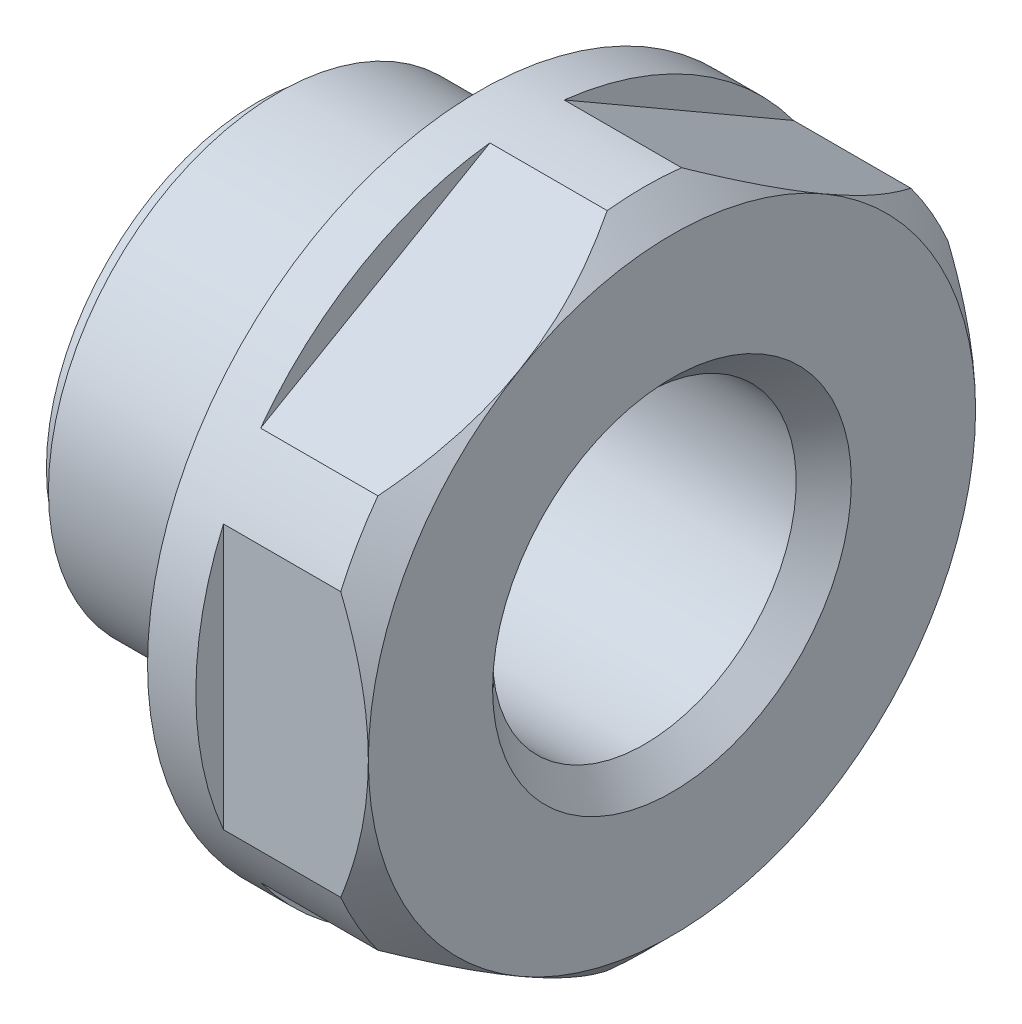
ISO-10303-21;
HEADER;
FILE_DESCRIPTION(('STEP AP214'),'2;1');
FILE_NAME('part.step','',(''),(''),'','','');
FILE_SCHEMA(('AUTOMOTIVE_DESIGN { 1 0 10303 214 1 1 1 1 }'));
ENDSEC;
DATA;
#1=APPLICATION_CONTEXT('core data for automotive mechanical design processes');
#2=APPLICATION_PROTOCOL_DEFINITION('international standard','automotive_design',2000,#1);
#3=PRODUCT_CONTEXT('',#1,'mechanical');
#4=PRODUCT('Part','Part','',(#3));
#5=PRODUCT_RELATED_PRODUCT_CATEGORY('part','',(#4));
#6=PRODUCT_DEFINITION_FORMATION('','',#4);
#7=PRODUCT_DEFINITION_CONTEXT('part definition',#1,'design');
#8=PRODUCT_DEFINITION('design','',#6,#7);
#9=PRODUCT_DEFINITION_SHAPE('','',#8);
#10=(LENGTH_UNIT() NAMED_UNIT(*) SI_UNIT(.MILLI.,.METRE.));
#11=(NAMED_UNIT(*) PLANE_ANGLE_UNIT() SI_UNIT($,.RADIAN.));
#12=(NAMED_UNIT(*) SI_UNIT($,.STERADIAN.) SOLID_ANGLE_UNIT());
#13=UNCERTAINTY_MEASURE_WITH_UNIT(LENGTH_MEASURE(1.E-05),#10,'distance_accuracy_value','');
#14=(GEOMETRIC_REPRESENTATION_CONTEXT(3) GLOBAL_UNCERTAINTY_ASSIGNED_CONTEXT((#13)) GLOBAL_UNIT_ASSIGNED_CONTEXT((#10,
#11,#12)) REPRESENTATION_CONTEXT('',''));
#15=CARTESIAN_POINT('',(0.,0.,0.));
#16=DIRECTION('',(0.,0.,1.));
#17=DIRECTION('',(1.,0.,0.));
#18=AXIS2_PLACEMENT_3D('',#15,#16,#17);
#19=CARTESIAN_POINT('',(15.,0.,0.));
#20=DIRECTION('',(-1.,0.,0.));
#21=DIRECTION('',(0.,0.,1.));
#22=AXIS2_PLACEMENT_3D('',#19,#20,#21);
#23=CONICAL_SURFACE('',#22,11.,0.785398163397449);
#24=CARTESIAN_POINT('',(13.9998,11.9244454096136,-1.34625469846722));
#25=CARTESIAN_POINT('',(14.1445628224522,11.7433959712892,-1.65984152432685));
#26=CARTESIAN_POINT('',(14.277541111226,11.5597804150405,-1.97787299680962));
#27=CARTESIAN_POINT('',(14.5146606594606,11.1874333370648,-2.62279705391353));
#28=CARTESIAN_POINT('',(14.6187222079065,10.9986892179367,-2.94971145787311));
#29=CARTESIAN_POINT('',(14.7911203117433,10.6187883903896,-3.60771899302234));
#30=CARTESIAN_POINT('',(14.8597656624482,10.4276679487631,-3.93874930828441));
#31=CARTESIAN_POINT('',(14.9335387949349,10.1392745048446,-4.43826140572109));
#32=CARTESIAN_POINT('',(14.9532620837518,10.0428945325663,-4.60519641453914));
#33=CARTESIAN_POINT('',(14.9826716146614,9.84975687211723,-4.93972065529193));
#34=CARTESIAN_POINT('',(14.9923593772953,9.75299924339799,-5.10730978425354));
#35=CARTESIAN_POINT('',(15.0013107847755,9.56348157904689,-5.43556400784146));
#36=CARTESIAN_POINT('',(15.0010000283072,9.47072644596864,-5.59622061099581));
#37=CARTESIAN_POINT('',(14.9910102119169,9.28534750229271,-5.91730636009597));
#38=CARTESIAN_POINT('',(14.981331655875,9.19272368490012,-6.07773551781094));
#39=CARTESIAN_POINT('',(14.9527693103516,9.00779350728968,-6.39804398128498));
#40=CARTESIAN_POINT('',(14.9338816980687,8.91548729495293,-6.55792303090647));
#41=CARTESIAN_POINT('',(14.8872257434231,8.73143337639274,-6.87671376918489));
#42=CARTESIAN_POINT('',(14.8594562488222,8.63968574420791,-7.03562532960317));
#43=CARTESIAN_POINT('',(14.763539044129,8.36578077209581,-7.51004265774708));
#44=CARTESIAN_POINT('',(14.6827411679731,8.18470629309542,-7.82367285532985));
#45=CARTESIAN_POINT('',(14.4918531093591,7.82650640430548,-8.44409326197959));
#46=CARTESIAN_POINT('',(14.3817585477406,7.64938158919044,-8.75088244104009));
#47=CARTESIAN_POINT('',(14.2187469556671,7.4161941000492,-9.15477501992216));
#48=CARTESIAN_POINT('',(14.1766721186819,7.35818353518767,-9.2552522656381));
#49=CARTESIAN_POINT('',(14.0900573229802,7.24274274158698,-9.45520158542059));
#50=CARTESIAN_POINT('',(14.0455219230475,7.18531165829434,-9.55467513961716));
#51=CARTESIAN_POINT('',(13.9998,7.12811347364407,-9.65374530153214));
#52=B_SPLINE_CURVE_WITH_KNOTS('',3,(#24,#25,#26,#27,#28,#29,#30,#31,#32,#33,#34,#35,#36,#37,#38,
#39,#40,#41,#42,#43,#44,#45,#46,#47,#48,#49,#50,#51),.UNSPECIFIED.,.F.,.F.,(4,2,2,2,2,2,2,2,2,2,
2,2,2,4),(0.,1.1702566741639,2.34370794522264,3.50674717519695,4.08782903846716,
4.66882284573654,5.22512004686029,5.78138732724696,6.33788571841848,6.89445633290154,
8.00606836288785,9.117846645962,9.48807194630575,9.85763292940879),.UNSPECIFIED.);
#53=CARTESIAN_POINT('',(14.,11.9241952032853,-1.34668806854028));
#54=VERTEX_POINT('',#53);
#55=CARTESIAN_POINT('',(15.,9.52627944162884,-5.49999999999968));
#56=VERTEX_POINT('',#55);
#57=EDGE_CURVE('E203',#54,#56,#52,.T.);
#58=ORIENTED_EDGE('',*,*,#57,.F.);
#59=CARTESIAN_POINT('',(14.,0.,0.));
#60=DIRECTION('',(-1.,0.,0.));
#61=DIRECTION('',(0.,0.,1.));
#62=AXIS2_PLACEMENT_3D('',#59,#60,#61);
#63=CIRCLE('',#62,12.);
#64=CARTESIAN_POINT('',(14.,11.9241952032853,1.34668806854029));
#65=VERTEX_POINT('',#64);
#66=EDGE_CURVE('E281',#65,#54,#63,.T.);
#67=ORIENTED_EDGE('',*,*,#66,.F.);
#68=CARTESIAN_POINT('',(13.9998,7.12811347364407,9.65374530153214));
#69=CARTESIAN_POINT('',(14.1445628224522,7.30916291196844,9.34015847567251));
#70=CARTESIAN_POINT('',(14.277541111226,7.49277846821713,9.02212700318974));
#71=CARTESIAN_POINT('',(14.5146606594606,7.86512554619291,8.37720294608584));
#72=CARTESIAN_POINT('',(14.6187222079065,8.05386966532093,8.05028854212626));
#73=CARTESIAN_POINT('',(14.7911203117433,8.43377049286812,7.39228100697703));
#74=CARTESIAN_POINT('',(14.8597656624482,8.62489093449459,7.06125069171495));
#75=CARTESIAN_POINT('',(14.9335387949349,8.91328437841312,6.56173859427827));
#76=CARTESIAN_POINT('',(14.9532620837518,9.00966435069138,6.39480358546023));
#77=CARTESIAN_POINT('',(14.9826716146614,9.20280201114045,6.06027934470743));
#78=CARTESIAN_POINT('',(14.9923593772953,9.29955963985969,5.89269021574582));
#79=CARTESIAN_POINT('',(15.0013107847755,9.48907730421079,5.5644359921579));
#80=CARTESIAN_POINT('',(15.0010000283072,9.58183243728904,5.40377938900356));
#81=CARTESIAN_POINT('',(14.9910102119169,9.76721138096496,5.08269363990339));
#82=CARTESIAN_POINT('',(14.981331655875,9.85983519835756,4.92226448218842));
#83=CARTESIAN_POINT('',(14.9527693103516,10.044765375968,4.60195601871438));
#84=CARTESIAN_POINT('',(14.9338816980687,10.1370715883047,4.44207696909289));
#85=CARTESIAN_POINT('',(14.8872257434231,10.3211255068649,4.12328623081447));
#86=CARTESIAN_POINT('',(14.8594562488222,10.4128731390498,3.96437467039619));
#87=CARTESIAN_POINT('',(14.763539044129,10.6867781111619,3.48995734225228));
#88=CARTESIAN_POINT('',(14.6827411679731,10.8678525901623,3.17632714466952));
#89=CARTESIAN_POINT('',(14.4918531093591,11.2260524789522,2.55590673801978));
#90=CARTESIAN_POINT('',(14.3817585477406,11.4031772940672,2.24911755895927));
#91=CARTESIAN_POINT('',(14.2187469556671,11.6363647832085,1.8452249800772));
#92=CARTESIAN_POINT('',(14.1766721186819,11.69437534807,1.74474773436126));
#93=CARTESIAN_POINT('',(14.0900573229802,11.8098161416707,1.54479841457878));
#94=CARTESIAN_POINT('',(14.0455219230475,11.8672472249633,1.44532486038221));
#95=CARTESIAN_POINT('',(13.9998,11.9244454096136,1.34625469846723));
#96=B_SPLINE_CURVE_WITH_KNOTS('',3,(#68,#69,#70,#71,#72,#73,#74,#75,#76,#77,#78,#79,#80,#81,#82,
#83,#84,#85,#86,#87,#88,#89,#90,#91,#92,#93,#94,#95),.UNSPECIFIED.,.F.,.F.,(4,2,2,2,2,2,2,2,2,2,
2,2,2,4),(0.,1.1702566741639,2.34370794522264,3.50674717519695,4.08782903846716,
4.66882284573654,5.22512004686029,5.78138732724696,6.33788571841848,6.89445633290154,
8.00606836288784,9.11784664596199,9.48807194630574,9.85763292940878),.UNSPECIFIED.);
#97=CARTESIAN_POINT('',(15.0000000000001,9.52627944162884,5.49999999999968));
#98=VERTEX_POINT('',#97);
#99=EDGE_CURVE('E225',#98,#65,#96,.T.);
#100=ORIENTED_EDGE('',*,*,#99,.F.);
#101=CARTESIAN_POINT('',(15.,0.,0.));
#102=DIRECTION('',(-1.,0.,0.));
#103=DIRECTION('',(0.,0.,1.));
#104=AXIS2_PLACEMENT_3D('',#101,#102,#103);
#105=CIRCLE('',#104,11.);
#106=EDGE_CURVE('E287',#98,#56,#105,.T.);
#107=ORIENTED_EDGE('',*,*,#106,.T.);
#108=EDGE_LOOP('',(#58,#67,#100,#107));
#109=FACE_BOUND('',#108,.T.);
#110=ADVANCED_FACE('F37',(#109),#23,.T.);
#111=CARTESIAN_POINT('',(14.,7.12836367997241,-9.65331193145908));
#112=VERTEX_POINT('',#111);
#113=EDGE_CURVE('E209',#56,#112,#52,.T.);
#114=ORIENTED_EDGE('',*,*,#113,.F.);
#115=CARTESIAN_POINT('',(15.,0.,-11.));
#116=VERTEX_POINT('',#115);
#117=EDGE_CURVE('E358',#56,#116,#105,.T.);
#118=ORIENTED_EDGE('',*,*,#117,.T.);
#119=CARTESIAN_POINT('',(3.96577969648767,19.0920628634969,-11.));
#120=CARTESIAN_POINT('',(4.21060873917786,18.8094938325582,-11.));
#121=CARTESIAN_POINT('',(4.45467558770401,18.5262624855258,-11.));
#122=CARTESIAN_POINT('',(4.94106332883009,17.9582967481221,-11.));
#123=CARTESIAN_POINT('',(5.18338419211057,17.6735623326491,-11.));
#124=CARTESIAN_POINT('',(5.66616492312053,17.102285723469,-11.));
#125=CARTESIAN_POINT('',(5.90662385122051,16.815742734588,-11.));
#126=CARTESIAN_POINT('',(6.3852747493329,16.2407742741586,-11.));
#127=CARTESIAN_POINT('',(6.62346672738961,15.9523488092963,-11.));
#128=CARTESIAN_POINT('',(7.34522649365814,15.0704042912935,-11.));
#129=CARTESIAN_POINT('',(7.82469762952826,14.4735052839264,-11.));
#130=CARTESIAN_POINT('',(8.53288205189279,13.5696349303673,-11.));
#131=CARTESIAN_POINT('',(8.76708187054833,13.2669575336775,-11.));
#132=CARTESIAN_POINT('',(9.23116003125471,12.6583111007197,-11.));
#133=CARTESIAN_POINT('',(9.46103846512202,12.3523421346054,-11.));
#134=CARTESIAN_POINT('',(9.91600275135897,11.7361912341999,-11.));
#135=CARTESIAN_POINT('',(10.1410814258906,11.4260039905529,-11.));
#136=CARTESIAN_POINT('',(10.5851092645453,10.8012573956843,-11.));
#137=CARTESIAN_POINT('',(10.8040583596595,10.4866979952992,-11.));
#138=CARTESIAN_POINT('',(11.2347429307399,9.8522653062536,-11.));
#139=CARTESIAN_POINT('',(11.4464719792148,9.53238764143882,-11.));
#140=CARTESIAN_POINT('',(11.8608947207902,8.88681987921158,-11.));
#141=CARTESIAN_POINT('',(12.0635886103184,8.56112990837654,-11.));
#142=CARTESIAN_POINT('',(12.4563353909345,7.90564211739838,-11.));
#143=CARTESIAN_POINT('',(12.6464747575036,7.57589635493903,-11.));
#144=CARTESIAN_POINT('',(13.0132692447311,6.90889173593487,-11.));
#145=CARTESIAN_POINT('',(13.1899227424871,6.57163198143809,-11.));
#146=CARTESIAN_POINT('',(13.5261984427109,5.88928805449324,-11.));
#147=CARTESIAN_POINT('',(13.6858457554045,5.54421635649298,-11.));
#148=CARTESIAN_POINT('',(13.9843150788588,4.8452530175827,-11.));
#149=CARTESIAN_POINT('',(14.1231452079505,4.49136487804506,-11.));
#150=CARTESIAN_POINT('',(14.3782073475186,3.76614615051212,-11.));
#151=CARTESIAN_POINT('',(14.4938387893721,3.39460132031391,-11.));
#152=CARTESIAN_POINT('',(14.6927645492187,2.64287060966887,-11.));
#153=CARTESIAN_POINT('',(14.7760640327309,2.26268611982071,-11.));
#154=CARTESIAN_POINT('',(14.904790351047,1.49820053728137,-11.));
#155=CARTESIAN_POINT('',(14.9504434641889,1.11393831251833,-11.));
#156=CARTESIAN_POINT('',(15.0013849602112,0.342725634013812,-11.));
#157=CARTESIAN_POINT('',(15.0066773550624,-0.0442245487095519,-11.));
#158=CARTESIAN_POINT('',(14.976475871607,-0.816903858217764,-11.));
#159=CARTESIAN_POINT('',(14.9409388672648,-1.20263126157534,-11.));
#160=CARTESIAN_POINT('',(14.83167501306,-1.9685978047968,-11.));
#161=CARTESIAN_POINT('',(14.7579407411816,-2.34883586327546,-11.));
#162=CARTESIAN_POINT('',(14.5764251823671,-3.10377609085114,-11.));
#163=CARTESIAN_POINT('',(14.4684086820688,-3.47842071341476,-11.));
#164=CARTESIAN_POINT('',(14.2241142850197,-4.21823347482963,-11.));
#165=CARTESIAN_POINT('',(14.0878361889268,-4.58340154681795,-11.));
#166=CARTESIAN_POINT('',(13.7580315935376,-5.3879576467948,-11.));
#167=CARTESIAN_POINT('',(13.5585598550472,-5.82488838215614,-11.));
#168=CARTESIAN_POINT('',(13.1330354824256,-6.68572098213254,-11.));
#169=CARTESIAN_POINT('',(12.9069674152859,-7.10961510027834,-11.));
#170=CARTESIAN_POINT('',(12.4341650293277,-7.94678618513242,-11.));
#171=CARTESIAN_POINT('',(12.1873886858756,-8.36003922362833,-11.));
#172=CARTESIAN_POINT('',(11.6783374290837,-9.17670411943141,-11.));
#173=CARTESIAN_POINT('',(11.4160656228568,-9.58011792691101,-11.));
#174=CARTESIAN_POINT('',(10.8780102902711,-10.3808922631398,-11.));
#175=CARTESIAN_POINT('',(10.6021626667986,-10.7782095197433,-11.));
#176=CARTESIAN_POINT('',(10.0408233435522,-11.5659692825111,-11.));
#177=CARTESIAN_POINT('',(9.75533127087747,-11.9564115219643,-11.));
#178=CARTESIAN_POINT('',(9.17697443431904,-12.7310834147329,-11.));
#179=CARTESIAN_POINT('',(8.88411850301585,-13.1153196805516,-11.));
#180=CARTESIAN_POINT('',(8.29218037974345,-13.8789419227187,-11.));
#181=CARTESIAN_POINT('',(7.99309832561235,-14.2583280061443,-11.));
#182=CARTESIAN_POINT('',(7.38761246693093,-15.0157619817528,-11.));
#183=CARTESIAN_POINT('',(7.08117111948803,-15.3937798125979,-11.));
#184=CARTESIAN_POINT('',(6.4639262818641,-16.1463459617244,-11.));
#185=CARTESIAN_POINT('',(6.15312201959204,-16.52089364593,-11.));
#186=CARTESIAN_POINT('',(5.53121097484058,-17.2630227823231,-11.));
#187=CARTESIAN_POINT('',(5.22014207804502,-17.6306360263294,-11.));
#188=CARTESIAN_POINT('',(4.59505741038123,-18.3632161480123,-11.));
#189=CARTESIAN_POINT('',(4.28104227270951,-18.728183565728,-11.));
#190=CARTESIAN_POINT('',(3.96577969648767,-19.0920628634969,-11.));
#191=B_SPLINE_CURVE_WITH_KNOTS('',3,(#119,#120,#121,#122,#123,#124,#125,#126,#127,#128,#129,
#130,#131,#132,#133,#134,#135,#136,#137,#138,#139,#140,#141,#142,#143,#144,#145,#146,#147,#148,
#149,#150,#151,#152,#153,#154,#155,#156,#157,#158,#159,#160,#161,#162,#163,#164,#165,#166,#167,
#168,#169,#170,#171,#172,#173,#174,#175,#176,#177,#178,#179,#180,#181,#182,#183,#184,#185,#186,
#187,#188,#189,#190),.UNSPECIFIED.,.F.,.F.,(4,2,2,2,2,2,2,2,2,2,2,2,2,2,2,2,2,2,2,2,2,2,2,2,2,2,
2,2,2,2,2,2,2,2,2,4),(0.,1.12164163611599,2.24330206370697,3.365495807213,4.48768556712503,
6.7843514034398,7.9324372660126,9.0804987075702,10.2301711646534,11.3798565599502,
12.5305400499796,13.6811985115162,14.8228566258147,15.9646519124764,17.1047372217868,
18.2443767552601,19.4105174580633,20.5764717754966,21.7353658137812,22.8941446531808,
24.0541485783499,25.2143779855768,26.3827464734967,27.5511232027391,28.9908271191067,
30.4313706093323,31.8749116635664,33.3181642383979,34.7690461831655,36.2199842903495,
37.6692580797479,39.1184998181959,40.578336828669,42.0384355228512,43.4831087361903,
44.9274782701595),.UNSPECIFIED.);
#192=CARTESIAN_POINT('',(14.,4.79583152331273,-11.));
#193=VERTEX_POINT('',#192);
#194=EDGE_CURVE('E190',#193,#116,#191,.T.);
#195=ORIENTED_EDGE('',*,*,#194,.F.);
#196=EDGE_CURVE('E331',#112,#193,#63,.T.);
#197=ORIENTED_EDGE('',*,*,#196,.F.);
#198=EDGE_LOOP('',(#114,#118,#195,#197));
#199=FACE_BOUND('',#198,.T.);
#200=ADVANCED_FACE('F357',(#199),#23,.T.);
#201=CARTESIAN_POINT('',(14.,-4.79583152331272,-11.));
#202=VERTEX_POINT('',#201);
#203=EDGE_CURVE('E196',#116,#202,#191,.T.);
#204=ORIENTED_EDGE('',*,*,#203,.F.);
#205=CARTESIAN_POINT('',(15.,-9.52627944162884,-5.49999999999968));
#206=VERTEX_POINT('',#205);
#207=EDGE_CURVE('E365',#116,#206,#105,.T.);
#208=ORIENTED_EDGE('',*,*,#207,.T.);
#209=CARTESIAN_POINT('',(13.9998,-7.12811347364407,-9.65374530153214));
#210=CARTESIAN_POINT('',(14.1445628224522,-7.30916291196844,-9.34015847567251));
#211=CARTESIAN_POINT('',(14.277541111226,-7.49277846821713,-9.02212700318974));
#212=CARTESIAN_POINT('',(14.5146606594606,-7.86512554619291,-8.37720294608584));
#213=CARTESIAN_POINT('',(14.6187222079065,-8.05386966532093,-8.05028854212626));
#214=CARTESIAN_POINT('',(14.7911203117433,-8.43377049286812,-7.39228100697703));
#215=CARTESIAN_POINT('',(14.8597656624482,-8.62489093449459,-7.06125069171495));
#216=CARTESIAN_POINT('',(14.9335387949349,-8.91328437841312,-6.56173859427827));
#217=CARTESIAN_POINT('',(14.9532620837518,-9.00966435069138,-6.39480358546023));
#218=CARTESIAN_POINT('',(14.9826716146614,-9.20280201114045,-6.06027934470743));
#219=CARTESIAN_POINT('',(14.9923593772953,-9.29955963985969,-5.89269021574582));
#220=CARTESIAN_POINT('',(15.0013107847755,-9.48907730421079,-5.5644359921579));
#221=CARTESIAN_POINT('',(15.0010000283072,-9.58183243728904,-5.40377938900356));
#222=CARTESIAN_POINT('',(14.9910102119169,-9.76721138096496,-5.08269363990339));
#223=CARTESIAN_POINT('',(14.981331655875,-9.85983519835756,-4.92226448218842));
#224=CARTESIAN_POINT('',(14.9527693103516,-10.044765375968,-4.60195601871438));
#225=CARTESIAN_POINT('',(14.9338816980687,-10.1370715883047,-4.44207696909289));
#226=CARTESIAN_POINT('',(14.8872257434231,-10.3211255068649,-4.12328623081447));
#227=CARTESIAN_POINT('',(14.8594562488222,-10.4128731390498,-3.96437467039619));
#228=CARTESIAN_POINT('',(14.763539044129,-10.6867781111619,-3.48995734225228));
#229=CARTESIAN_POINT('',(14.6827411679731,-10.8678525901623,-3.17632714466952));
#230=CARTESIAN_POINT('',(14.4918531093591,-11.2260524789522,-2.55590673801978));
#231=CARTESIAN_POINT('',(14.3817585477406,-11.4031772940672,-2.24911755895927));
#232=CARTESIAN_POINT('',(14.2187469556671,-11.6363647832085,-1.8452249800772));
#233=CARTESIAN_POINT('',(14.1766721186819,-11.69437534807,-1.74474773436126));
#234=CARTESIAN_POINT('',(14.0900573229801,-11.8098161416707,-1.54479841457877));
#235=CARTESIAN_POINT('',(14.0455219230475,-11.8672472249633,-1.44532486038221));
#236=CARTESIAN_POINT('',(13.9998,-11.9244454096136,-1.34625469846722));
#237=B_SPLINE_CURVE_WITH_KNOTS('',3,(#209,#210,#211,#212,#213,#214,#215,#216,#217,#218,#219,
#220,#221,#222,#223,#224,#225,#226,#227,#228,#229,#230,#231,#232,#233,#234,#235,#236),
.UNSPECIFIED.,.F.,.F.,(4,2,2,2,2,2,2,2,2,2,2,2,2,4),(0.,1.1702566741639,2.34370794522264,
3.50674717519695,4.08782903846716,4.66882284573654,5.22512004686029,5.78138732724696,
6.33788571841848,6.89445633290154,8.00606836288784,9.11784664596199,9.48807194630575,
9.85763292940879),.UNSPECIFIED.);
#238=CARTESIAN_POINT('',(14.,-7.12836367997241,-9.65331193145908));
#239=VERTEX_POINT('',#238);
#240=EDGE_CURVE('E159',#239,#206,#237,.T.);
#241=ORIENTED_EDGE('',*,*,#240,.F.);
#242=EDGE_CURVE('E158',#202,#239,#63,.T.);
#243=ORIENTED_EDGE('',*,*,#242,.F.);
#244=EDGE_LOOP('',(#204,#208,#241,#243));
#245=FACE_BOUND('',#244,.T.);
#246=ADVANCED_FACE('F395',(#245),#23,.T.);
#247=CARTESIAN_POINT('',(14.,-11.9241952032853,-1.34668806854029));
#248=VERTEX_POINT('',#247);
#249=EDGE_CURVE('E161',#206,#248,#237,.T.);
#250=ORIENTED_EDGE('',*,*,#249,.F.);
#251=CARTESIAN_POINT('',(15.0000000000001,-9.52627944162884,5.49999999999968));
#252=VERTEX_POINT('',#251);
#253=EDGE_CURVE('E288',#206,#252,#105,.T.);
#254=ORIENTED_EDGE('',*,*,#253,.T.);
#255=CARTESIAN_POINT('',(13.9998,-11.9244454096136,1.34625469846723));
#256=CARTESIAN_POINT('',(14.1445628224522,-11.7433959712892,1.65984152432686));
#257=CARTESIAN_POINT('',(14.277541111226,-11.5597804150405,1.97787299680963));
#258=CARTESIAN_POINT('',(14.5146606594606,-11.1874333370648,2.62279705391353));
#259=CARTESIAN_POINT('',(14.6187222079065,-10.9986892179367,2.94971145787311));
#260=CARTESIAN_POINT('',(14.7911203117433,-10.6187883903896,3.60771899302234));
#261=CARTESIAN_POINT('',(14.8597656624482,-10.4276679487631,3.93874930828441));
#262=CARTESIAN_POINT('',(14.9335387949349,-10.1392745048446,4.4382614057211));
#263=CARTESIAN_POINT('',(14.9532620837518,-10.0428945325663,4.60519641453914));
#264=CARTESIAN_POINT('',(14.9826716146614,-9.84975687211722,4.93972065529194));
#265=CARTESIAN_POINT('',(14.9923593772953,-9.75299924339799,5.10730978425355));
#266=CARTESIAN_POINT('',(15.0013107847755,-9.56348157904688,5.43556400784147));
#267=CARTESIAN_POINT('',(15.0010000283072,-9.47072644596864,5.59622061099581));
#268=CARTESIAN_POINT('',(14.9910102119169,-9.28534750229271,5.91730636009598));
#269=CARTESIAN_POINT('',(14.981331655875,-9.19272368490012,6.07773551781095));
#270=CARTESIAN_POINT('',(14.9527693103516,-9.00779350728967,6.39804398128499));
#271=CARTESIAN_POINT('',(14.9338816980687,-8.91548729495293,6.55792303090648));
#272=CARTESIAN_POINT('',(14.8872257434231,-8.73143337639274,6.8767137691849));
#273=CARTESIAN_POINT('',(14.8594562488222,-8.6396857442079,7.03562532960317));
#274=CARTESIAN_POINT('',(14.763539044129,-8.36578077209581,7.51004265774708));
#275=CARTESIAN_POINT('',(14.6827411679731,-8.18470629309542,7.82367285532985));
#276=CARTESIAN_POINT('',(14.4918531093591,-7.82650640430547,8.44409326197959));
#277=CARTESIAN_POINT('',(14.3817585477406,-7.64938158919044,8.75088244104009));
#278=CARTESIAN_POINT('',(14.2187469556671,-7.41619410004919,9.15477501992217));
#279=CARTESIAN_POINT('',(14.1766721186819,-7.35818353518767,9.25525226563811));
#280=CARTESIAN_POINT('',(14.0900573229802,-7.24274274158698,9.45520158542059));
#281=CARTESIAN_POINT('',(14.0455219230475,-7.18531165829434,9.55467513961715));
#282=CARTESIAN_POINT('',(13.9998,-7.12811347364407,9.65374530153214));
#283=B_SPLINE_CURVE_WITH_KNOTS('',3,(#255,#256,#257,#258,#259,#260,#261,#262,#263,#264,#265,
#266,#267,#268,#269,#270,#271,#272,#273,#274,#275,#276,#277,#278,#279,#280,#281,#282),
.UNSPECIFIED.,.F.,.F.,(4,2,2,2,2,2,2,2,2,2,2,2,2,4),(0.,1.1702566741639,2.34370794522264,
3.50674717519695,4.08782903846716,4.66882284573654,5.22512004686029,5.78138732724696,
6.33788571841848,6.89445633290154,8.00606836288784,9.11784664596199,9.48807194630574,
9.85763292940879),.UNSPECIFIED.);
#284=CARTESIAN_POINT('',(14.,-11.9241952032853,1.34668806854028));
#285=VERTEX_POINT('',#284);
#286=EDGE_CURVE('E252',#285,#252,#283,.T.);
#287=ORIENTED_EDGE('',*,*,#286,.F.);
#288=EDGE_CURVE('E282',#248,#285,#63,.T.);
#289=ORIENTED_EDGE('',*,*,#288,.F.);
#290=EDGE_LOOP('',(#250,#254,#287,#289));
#291=FACE_BOUND('',#290,.T.);
#292=ADVANCED_FACE('F338',(#291),#23,.T.);
#293=CARTESIAN_POINT('',(15.,0.,0.));
#294=DIRECTION('',(-1.,0.,0.));
#295=DIRECTION('',(0.,0.,1.));
#296=AXIS2_PLACEMENT_3D('',#293,#294,#295);
#297=CYLINDRICAL_SURFACE('',#296,12.);
#298=CARTESIAN_POINT('',(8.,0.,0.));
#299=DIRECTION('',(-1.,0.,0.));
#300=DIRECTION('',(0.,0.,1.));
#301=AXIS2_PLACEMENT_3D('',#298,#299,#300);
#302=CIRCLE('',#301,12.);
#303=CARTESIAN_POINT('',(8.,0.,12.));
#304=VERTEX_POINT('',#303);
#305=EDGE_CURVE('E273',#304,#304,#302,.T.);
#306=ORIENTED_EDGE('',*,*,#305,.F.);
#307=EDGE_LOOP('',(#306));
#308=FACE_BOUND('',#307,.T.);
#309=DIRECTION('',(-1.,0.,0.));
#310=VECTOR('',#309,1.);
#311=CARTESIAN_POINT('',(15.,7.12836367997241,-9.65331193145908));
#312=LINE('',#311,#310);
#313=CARTESIAN_POINT('',(9.75,7.12836367997241,-9.65331193145907));
#314=VERTEX_POINT('',#313);
#315=EDGE_CURVE('E210',#112,#314,#312,.T.);
#316=ORIENTED_EDGE('',*,*,#315,.F.);
#317=ORIENTED_EDGE('',*,*,#196,.T.);
#318=DIRECTION('',(-1.,0.,0.));
#319=VECTOR('',#318,1.);
#320=CARTESIAN_POINT('',(15.,4.79583152331273,-11.));
#321=LINE('',#320,#319);
#322=CARTESIAN_POINT('',(9.75,4.79583152331272,-11.));
#323=VERTEX_POINT('',#322);
#324=EDGE_CURVE('E197',#323,#193,#321,.F.);
#325=ORIENTED_EDGE('',*,*,#324,.F.);
#326=CARTESIAN_POINT('',(9.75,0.,0.));
#327=DIRECTION('',(1.,0.,0.));
#328=DIRECTION('',(0.,0.,-1.));
#329=AXIS2_PLACEMENT_3D('',#326,#327,#328);
#330=CIRCLE('',#329,12.);
#331=CARTESIAN_POINT('',(9.75,-4.79583152331272,-11.));
#332=VERTEX_POINT('',#331);
#333=EDGE_CURVE('E41',#332,#323,#330,.T.);
#334=ORIENTED_EDGE('',*,*,#333,.F.);
#335=DIRECTION('',(-1.,0.,0.));
#336=VECTOR('',#335,1.);
#337=CARTESIAN_POINT('',(15.,-4.79583152331273,-11.));
#338=LINE('',#337,#336);
#339=EDGE_CURVE('E198',#202,#332,#338,.T.);
#340=ORIENTED_EDGE('',*,*,#339,.F.);
#341=ORIENTED_EDGE('',*,*,#242,.T.);
#342=DIRECTION('',(-1.,0.,0.));
#343=VECTOR('',#342,1.);
#344=CARTESIAN_POINT('',(15.,-7.12836367997241,-9.65331193145908));
#345=LINE('',#344,#343);
#346=CARTESIAN_POINT('',(9.75,-7.12836367997241,-9.65331193145908));
#347=VERTEX_POINT('',#346);
#348=EDGE_CURVE('E148',#347,#239,#345,.F.);
#349=ORIENTED_EDGE('',*,*,#348,.F.);
#350=CARTESIAN_POINT('',(9.75,-11.9241952032853,-1.34668806854028));
#351=VERTEX_POINT('',#350);
#352=EDGE_CURVE('E46',#351,#347,#330,.T.);
#353=ORIENTED_EDGE('',*,*,#352,.F.);
#354=DIRECTION('',(-1.,0.,0.));
#355=VECTOR('',#354,1.);
#356=CARTESIAN_POINT('',(15.,-11.9241952032853,-1.34668806854028));
#357=LINE('',#356,#355);
#358=EDGE_CURVE('E150',#248,#351,#357,.T.);
#359=ORIENTED_EDGE('',*,*,#358,.F.);
#360=ORIENTED_EDGE('',*,*,#288,.T.);
#361=DIRECTION('',(-1.,0.,0.));
#362=VECTOR('',#361,1.);
#363=CARTESIAN_POINT('',(15.,-11.9241952032853,1.34668806854028));
#364=LINE('',#363,#362);
#365=CARTESIAN_POINT('',(9.75,-11.9241952032853,1.34668806854029));
#366=VERTEX_POINT('',#365);
#367=EDGE_CURVE('E305',#366,#285,#364,.F.);
#368=ORIENTED_EDGE('',*,*,#367,.F.);
#369=CARTESIAN_POINT('',(9.75,0.,0.));
#370=DIRECTION('',(1.,0.,0.));
#371=DIRECTION('',(0.,0.,-1.));
#372=AXIS2_PLACEMENT_3D('',#369,#370,#371);
#373=CIRCLE('',#372,12.);
#374=CARTESIAN_POINT('',(9.75,-7.12836367997241,9.65331193145907));
#375=VERTEX_POINT('',#374);
#376=EDGE_CURVE('E303',#375,#366,#373,.T.);
#377=ORIENTED_EDGE('',*,*,#376,.F.);
#378=DIRECTION('',(-1.,0.,0.));
#379=VECTOR('',#378,1.);
#380=CARTESIAN_POINT('',(15.,-7.12836367997241,9.65331193145908));
#381=LINE('',#380,#379);
#382=CARTESIAN_POINT('',(14.,-7.12836367997241,9.65331193145908));
#383=VERTEX_POINT('',#382);
#384=EDGE_CURVE('E310',#383,#375,#381,.T.);
#385=ORIENTED_EDGE('',*,*,#384,.F.);
#386=CARTESIAN_POINT('',(14.,-4.79583152331273,11.));
#387=VERTEX_POINT('',#386);
#388=EDGE_CURVE('E276',#383,#387,#63,.T.);
#389=ORIENTED_EDGE('',*,*,#388,.T.);
#390=DIRECTION('',(-1.,0.,0.));
#391=VECTOR('',#390,1.);
#392=CARTESIAN_POINT('',(15.,-4.79583152331273,11.));
#393=LINE('',#392,#391);
#394=CARTESIAN_POINT('',(9.75,-4.79583152331272,11.));
#395=VERTEX_POINT('',#394);
#396=EDGE_CURVE('E313',#395,#387,#393,.F.);
#397=ORIENTED_EDGE('',*,*,#396,.F.);
#398=CARTESIAN_POINT('',(9.75,4.79583152331272,11.));
#399=VERTEX_POINT('',#398);
#400=EDGE_CURVE('E307',#399,#395,#373,.T.);
#401=ORIENTED_EDGE('',*,*,#400,.F.);
#402=DIRECTION('',(-1.,0.,0.));
#403=VECTOR('',#402,1.);
#404=CARTESIAN_POINT('',(15.,4.79583152331273,11.));
#405=LINE('',#404,#403);
#406=CARTESIAN_POINT('',(14.,4.79583152331272,11.));
#407=VERTEX_POINT('',#406);
#408=EDGE_CURVE('E315',#407,#399,#405,.T.);
#409=ORIENTED_EDGE('',*,*,#408,.F.);
#410=CARTESIAN_POINT('',(14.,7.12836367997241,9.65331193145908));
#411=VERTEX_POINT('',#410);
#412=EDGE_CURVE('E277',#407,#411,#63,.T.);
#413=ORIENTED_EDGE('',*,*,#412,.T.);
#414=DIRECTION('',(-1.,0.,0.));
#415=VECTOR('',#414,1.);
#416=CARTESIAN_POINT('',(15.,7.12836367997241,9.65331193145908));
#417=LINE('',#416,#415);
#418=CARTESIAN_POINT('',(9.75,7.12836367997241,9.65331193145908));
#419=VERTEX_POINT('',#418);
#420=EDGE_CURVE('E318',#419,#411,#417,.F.);
#421=ORIENTED_EDGE('',*,*,#420,.F.);
#422=CARTESIAN_POINT('',(9.75,11.9241952032853,1.34668806854028));
#423=VERTEX_POINT('',#422);
#424=EDGE_CURVE('E306',#423,#419,#373,.T.);
#425=ORIENTED_EDGE('',*,*,#424,.F.);
#426=DIRECTION('',(-1.,0.,0.));
#427=VECTOR('',#426,1.);
#428=CARTESIAN_POINT('',(15.,11.9241952032853,1.34668806854028));
#429=LINE('',#428,#427);
#430=EDGE_CURVE('E319',#65,#423,#429,.T.);
#431=ORIENTED_EDGE('',*,*,#430,.F.);
#432=ORIENTED_EDGE('',*,*,#66,.T.);
#433=DIRECTION('',(-1.,0.,0.));
#434=VECTOR('',#433,1.);
#435=CARTESIAN_POINT('',(15.,11.9241952032853,-1.34668806854028));
#436=LINE('',#435,#434);
#437=CARTESIAN_POINT('',(9.75,11.9241952032853,-1.34668806854029));
#438=VERTEX_POINT('',#437);
#439=EDGE_CURVE('E201',#438,#54,#436,.F.);
#440=ORIENTED_EDGE('',*,*,#439,.F.);
#441=EDGE_CURVE('E11',#314,#438,#330,.T.);
#442=ORIENTED_EDGE('',*,*,#441,.F.);
#443=EDGE_LOOP('',(#316,#317,#325,#334,#340,#341,#349,#353,#359,#360,#368,#377,#385,#389,#397,
#401,#409,#413,#421,#425,#431,#432,#440,#442));
#444=FACE_BOUND('',#443,.T.);
#445=ADVANCED_FACE('F155',(#308,#444),#297,.T.);
#446=EDGE_CURVE('E259',#252,#383,#283,.T.);
#447=ORIENTED_EDGE('',*,*,#446,.F.);
#448=CARTESIAN_POINT('',(15.,0.,11.));
#449=VERTEX_POINT('',#448);
#450=EDGE_CURVE('E280',#252,#449,#105,.T.);
#451=ORIENTED_EDGE('',*,*,#450,.T.);
#452=CARTESIAN_POINT('',(3.96577969648767,-19.0920628634969,11.));
#453=CARTESIAN_POINT('',(4.21060873917786,-18.8094938325582,11.));
#454=CARTESIAN_POINT('',(4.45467558770401,-18.5262624855258,11.));
#455=CARTESIAN_POINT('',(4.9410633288301,-17.9582967481221,11.));
#456=CARTESIAN_POINT('',(5.18338419211057,-17.6735623326491,11.));
#457=CARTESIAN_POINT('',(5.66616492312053,-17.102285723469,11.));
#458=CARTESIAN_POINT('',(5.90662385122051,-16.815742734588,11.));
#459=CARTESIAN_POINT('',(6.3852747493329,-16.2407742741586,11.));
#460=CARTESIAN_POINT('',(6.62346672738961,-15.9523488092963,11.));
#461=CARTESIAN_POINT('',(7.34522649365814,-15.0704042912935,11.));
#462=CARTESIAN_POINT('',(7.82469762952826,-14.4735052839264,11.));
#463=CARTESIAN_POINT('',(8.53288205189279,-13.5696349303673,11.));
#464=CARTESIAN_POINT('',(8.76708187054833,-13.2669575336775,11.));
#465=CARTESIAN_POINT('',(9.23116003125471,-12.6583111007197,11.));
#466=CARTESIAN_POINT('',(9.46103846512202,-12.3523421346054,11.));
#467=CARTESIAN_POINT('',(9.91600275135897,-11.7361912341999,11.));
#468=CARTESIAN_POINT('',(10.1410814258906,-11.4260039905529,11.));
#469=CARTESIAN_POINT('',(10.5851092645453,-10.8012573956843,11.));
#470=CARTESIAN_POINT('',(10.8040583596595,-10.4866979952992,11.));
#471=CARTESIAN_POINT('',(11.2347429307399,-9.85226530625359,11.));
#472=CARTESIAN_POINT('',(11.4464719792148,-9.53238764143882,11.));
#473=CARTESIAN_POINT('',(11.8608947207902,-8.88681987921157,11.));
#474=CARTESIAN_POINT('',(12.0635886103184,-8.56112990837654,11.));
#475=CARTESIAN_POINT('',(12.4563353909345,-7.90564211739838,11.));
#476=CARTESIAN_POINT('',(12.6464747575036,-7.57589635493903,11.));
#477=CARTESIAN_POINT('',(13.0132692447311,-6.90889173593487,11.));
#478=CARTESIAN_POINT('',(13.1899227424871,-6.57163198143808,11.));
#479=CARTESIAN_POINT('',(13.5261984427109,-5.88928805449324,11.));
#480=CARTESIAN_POINT('',(13.6858457554045,-5.54421635649297,11.));
#481=CARTESIAN_POINT('',(13.9843150788588,-4.8452530175827,11.));
#482=CARTESIAN_POINT('',(14.1231452079505,-4.49136487804505,11.));
#483=CARTESIAN_POINT('',(14.3782073475186,-3.76614615051212,11.));
#484=CARTESIAN_POINT('',(14.4938387893721,-3.39460132031391,11.));
#485=CARTESIAN_POINT('',(14.6927645492187,-2.64287060966886,11.));
#486=CARTESIAN_POINT('',(14.7760640327309,-2.2626861198207,11.));
#487=CARTESIAN_POINT('',(14.904790351047,-1.49820053728137,11.));
#488=CARTESIAN_POINT('',(14.9504434641889,-1.11393831251832,11.));
#489=CARTESIAN_POINT('',(15.0013849602112,-0.342725634013806,11.));
#490=CARTESIAN_POINT('',(15.0066773550624,0.0442245487095572,11.));
#491=CARTESIAN_POINT('',(14.976475871607,0.816903858217768,11.));
#492=CARTESIAN_POINT('',(14.9409388672648,1.20263126157535,11.));
#493=CARTESIAN_POINT('',(14.83167501306,1.96859780479681,11.));
#494=CARTESIAN_POINT('',(14.7579407411816,2.34883586327547,11.));
#495=CARTESIAN_POINT('',(14.5764251823671,3.10377609085115,11.));
#496=CARTESIAN_POINT('',(14.4684086820688,3.47842071341477,11.));
#497=CARTESIAN_POINT('',(14.2241142850196,4.21823347482964,11.));
#498=CARTESIAN_POINT('',(14.0878361889268,4.58340154681796,11.));
#499=CARTESIAN_POINT('',(13.7580315935376,5.38795764679481,11.));
#500=CARTESIAN_POINT('',(13.5585598550472,5.82488838215615,11.));
#501=CARTESIAN_POINT('',(13.1330354824256,6.68572098213256,11.));
#502=CARTESIAN_POINT('',(12.9069674152859,7.10961510027835,11.));
#503=CARTESIAN_POINT('',(12.4341650293277,7.94678618513243,11.));
#504=CARTESIAN_POINT('',(12.1873886858756,8.36003922362834,11.));
#505=CARTESIAN_POINT('',(11.6783374290837,9.17670411943143,11.));
#506=CARTESIAN_POINT('',(11.4160656228568,9.58011792691102,11.));
#507=CARTESIAN_POINT('',(10.878010290271,10.3808922631398,11.));
#508=CARTESIAN_POINT('',(10.6021626667986,10.7782095197433,11.));
#509=CARTESIAN_POINT('',(10.0408233435522,11.5659692825111,11.));
#510=CARTESIAN_POINT('',(9.75533127087746,11.9564115219643,11.));
#511=CARTESIAN_POINT('',(9.17697443431903,12.7310834147329,11.));
#512=CARTESIAN_POINT('',(8.88411850301584,13.1153196805516,11.));
#513=CARTESIAN_POINT('',(8.29218037974344,13.8789419227188,11.));
#514=CARTESIAN_POINT('',(7.99309832561233,14.2583280061444,11.));
#515=CARTESIAN_POINT('',(7.38761246693091,15.0157619817528,11.));
#516=CARTESIAN_POINT('',(7.08117111948801,15.3937798125979,11.));
#517=CARTESIAN_POINT('',(6.46392628186408,16.1463459617244,11.));
#518=CARTESIAN_POINT('',(6.15312201959203,16.52089364593,11.));
#519=CARTESIAN_POINT('',(5.53121097484058,17.2630227823231,11.));
#520=CARTESIAN_POINT('',(5.22014207804501,17.6306360263294,11.));
#521=CARTESIAN_POINT('',(4.59505741038122,18.3632161480123,11.));
#522=CARTESIAN_POINT('',(4.2810422727095,18.728183565728,11.));
#523=CARTESIAN_POINT('',(3.96577969648767,19.0920628634969,11.));
#524=B_SPLINE_CURVE_WITH_KNOTS('',3,(#452,#453,#454,#455,#456,#457,#458,#459,#460,#461,#462,
#463,#464,#465,#466,#467,#468,#469,#470,#471,#472,#473,#474,#475,#476,#477,#478,#479,#480,#481,
#482,#483,#484,#485,#486,#487,#488,#489,#490,#491,#492,#493,#494,#495,#496,#497,#498,#499,#500,
#501,#502,#503,#504,#505,#506,#507,#508,#509,#510,#511,#512,#513,#514,#515,#516,#517,#518,#519,
#520,#521,#522,#523),.UNSPECIFIED.,.F.,.F.,(4,2,2,2,2,2,2,2,2,2,2,2,2,2,2,2,2,2,2,2,2,2,2,2,2,2,
2,2,2,2,2,2,2,2,2,4),(0.,1.12164163611599,2.24330206370697,3.36549580721299,4.48768556712503,
6.7843514034398,7.9324372660126,9.0804987075702,10.2301711646534,11.3798565599502,
12.5305400499796,13.6811985115162,14.8228566258147,15.9646519124764,17.1047372217868,
18.2443767552601,19.4105174580633,20.5764717754966,21.7353658137812,22.8941446531808,
24.0541485783499,25.2143779855768,26.3827464734967,27.5511232027391,28.9908271191068,
30.4313706093323,31.8749116635664,33.3181642383979,34.7690461831655,36.2199842903495,
37.6692580797479,39.1184998181959,40.578336828669,42.0384355228512,43.4831087361903,
44.9274782701595),.UNSPECIFIED.);
#525=EDGE_CURVE('E226',#387,#449,#524,.T.);
#526=ORIENTED_EDGE('',*,*,#525,.F.);
#527=ORIENTED_EDGE('',*,*,#388,.F.);
#528=EDGE_LOOP('',(#447,#451,#526,#527));
#529=FACE_BOUND('',#528,.T.);
#530=ADVANCED_FACE('F372',(#529),#23,.T.);
#531=EDGE_CURVE('E260',#449,#407,#524,.T.);
#532=ORIENTED_EDGE('',*,*,#531,.F.);
#533=EDGE_CURVE('E283',#449,#98,#105,.T.);
#534=ORIENTED_EDGE('',*,*,#533,.T.);
#535=EDGE_CURVE('E218',#411,#98,#96,.T.);
#536=ORIENTED_EDGE('',*,*,#535,.F.);
#537=ORIENTED_EDGE('',*,*,#412,.F.);
#538=EDGE_LOOP('',(#532,#534,#536,#537));
#539=FACE_BOUND('',#538,.T.);
#540=ADVANCED_FACE('F376',(#539),#23,.T.);
#541=CARTESIAN_POINT('',(0.,7.6636,0.));
#542=DIRECTION('',(1.,0.,0.));
#543=DIRECTION('',(0.,0.,-1.));
#544=AXIS2_PLACEMENT_3D('',#541,#542,#543);
#545=PLANE('',#544);
#546=CARTESIAN_POINT('',(0.,0.,0.));
#547=DIRECTION('',(-1.,0.,0.));
#548=DIRECTION('',(0.,0.,1.));
#549=AXIS2_PLACEMENT_3D('',#546,#547,#548);
#550=CIRCLE('',#549,6.5);
#551=CARTESIAN_POINT('',(0.,0.,6.5));
#552=VERTEX_POINT('',#551);
#553=EDGE_CURVE('E300',#552,#552,#550,.T.);
#554=ORIENTED_EDGE('',*,*,#553,.F.);
#555=EDGE_LOOP('',(#554));
#556=FACE_BOUND('',#555,.T.);
#557=CARTESIAN_POINT('',(0.,0.,0.));
#558=DIRECTION('',(-1.,0.,0.));
#559=DIRECTION('',(0.,0.,1.));
#560=AXIS2_PLACEMENT_3D('',#557,#558,#559);
#561=CIRCLE('',#560,7.6636);
#562=CARTESIAN_POINT('',(0.,0.,7.6636));
#563=VERTEX_POINT('',#562);
#564=EDGE_CURVE('E261',#563,#563,#561,.T.);
#565=ORIENTED_EDGE('',*,*,#564,.T.);
#566=EDGE_LOOP('',(#565));
#567=FACE_BOUND('',#566,.T.);
#568=ADVANCED_FACE('F39',(#556,#567),#545,.F.);
#569=CARTESIAN_POINT('',(15.,0.,0.));
#570=DIRECTION('',(-1.,0.,0.));
#571=DIRECTION('',(0.,0.,1.));
#572=AXIS2_PLACEMENT_3D('',#569,#570,#571);
#573=CYLINDRICAL_SURFACE('',#572,6.5);
#574=CARTESIAN_POINT('',(6.1538461538462,0.,0.));
#575=DIRECTION('',(-1.,0.,0.));
#576=DIRECTION('',(0.,0.,1.));
#577=AXIS2_PLACEMENT_3D('',#574,#575,#576);
#578=CIRCLE('',#577,6.5);
#579=CARTESIAN_POINT('',(6.1538461538462,0.,6.5));
#580=VERTEX_POINT('',#579);
#581=EDGE_CURVE('E297',#580,#580,#578,.T.);
#582=ORIENTED_EDGE('',*,*,#581,.F.);
#583=EDGE_LOOP('',(#582));
#584=FACE_BOUND('',#583,.T.);
#585=ORIENTED_EDGE('',*,*,#553,.T.);
#586=EDGE_LOOP('',(#585));
#587=FACE_BOUND('',#586,.T.);
#588=ADVANCED_FACE('F401',(#584,#587),#573,.F.);
#589=CARTESIAN_POINT('',(6.1538461538462,6.5,0.));
#590=DIRECTION('',(1.,0.,0.));
#591=DIRECTION('',(0.,0.,-1.));
#592=AXIS2_PLACEMENT_3D('',#589,#590,#591);
#593=PLANE('',#592);
#594=CARTESIAN_POINT('',(6.1538461538462,0.,0.));
#595=DIRECTION('',(-1.,0.,0.));
#596=DIRECTION('',(0.,0.,1.));
#597=AXIS2_PLACEMENT_3D('',#594,#595,#596);
#598=CIRCLE('',#597,5.5);
#599=CARTESIAN_POINT('',(6.1538461538462,0.,5.5));
#600=VERTEX_POINT('',#599);
#601=EDGE_CURVE('E294',#600,#600,#598,.T.);
#602=ORIENTED_EDGE('',*,*,#601,.F.);
#603=EDGE_LOOP('',(#602));
#604=FACE_BOUND('',#603,.T.);
#605=ORIENTED_EDGE('',*,*,#581,.T.);
#606=EDGE_LOOP('',(#605));
#607=FACE_BOUND('',#606,.T.);
#608=ADVANCED_FACE('F526',(#604,#607),#593,.F.);
#609=CARTESIAN_POINT('',(15.,0.,0.));
#610=DIRECTION('',(-1.,0.,0.));
#611=DIRECTION('',(0.,0.,1.));
#612=AXIS2_PLACEMENT_3D('',#609,#610,#611);
#613=CYLINDRICAL_SURFACE('',#612,5.5);
#614=CARTESIAN_POINT('',(14.,0.,0.));
#615=DIRECTION('',(-1.,0.,0.));
#616=DIRECTION('',(0.,0.,1.));
#617=AXIS2_PLACEMENT_3D('',#614,#615,#616);
#618=CIRCLE('',#617,5.5);
#619=CARTESIAN_POINT('',(14.,0.,5.5));
#620=VERTEX_POINT('',#619);
#621=EDGE_CURVE('E291',#620,#620,#618,.T.);
#622=ORIENTED_EDGE('',*,*,#621,.F.);
#623=EDGE_LOOP('',(#622));
#624=FACE_BOUND('',#623,.T.);
#625=ORIENTED_EDGE('',*,*,#601,.T.);
#626=EDGE_LOOP('',(#625));
#627=FACE_BOUND('',#626,.T.);
#628=ADVANCED_FACE('F516',(#624,#627),#613,.F.);
#629=CARTESIAN_POINT('',(14.,0.,0.));
#630=DIRECTION('',(1.,0.,0.));
#631=DIRECTION('',(0.,0.,-1.));
#632=AXIS2_PLACEMENT_3D('',#629,#630,#631);
#633=CONICAL_SURFACE('',#632,5.5,0.785398163397449);
#634=CARTESIAN_POINT('',(15.,0.,0.));
#635=DIRECTION('',(-1.,0.,0.));
#636=DIRECTION('',(0.,0.,1.));
#637=AXIS2_PLACEMENT_3D('',#634,#635,#636);
#638=CIRCLE('',#637,6.5);
#639=CARTESIAN_POINT('',(15.,0.,6.5));
#640=VERTEX_POINT('',#639);
#641=EDGE_CURVE('E286',#640,#640,#638,.T.);
#642=ORIENTED_EDGE('',*,*,#641,.F.);
#643=EDGE_LOOP('',(#642));
#644=FACE_BOUND('',#643,.T.);
#645=ORIENTED_EDGE('',*,*,#621,.T.);
#646=EDGE_LOOP('',(#645));
#647=FACE_BOUND('',#646,.T.);
#648=ADVANCED_FACE('F511',(#644,#647),#633,.F.);
#649=CARTESIAN_POINT('',(15.,6.5,0.));
#650=DIRECTION('',(-1.,0.,0.));
#651=DIRECTION('',(0.,0.,1.));
#652=AXIS2_PLACEMENT_3D('',#649,#650,#651);
#653=PLANE('',#652);
#654=ORIENTED_EDGE('',*,*,#533,.F.);
#655=ORIENTED_EDGE('',*,*,#450,.F.);
#656=ORIENTED_EDGE('',*,*,#253,.F.);
#657=ORIENTED_EDGE('',*,*,#207,.F.);
#658=ORIENTED_EDGE('',*,*,#117,.F.);
#659=ORIENTED_EDGE('',*,*,#106,.F.);
#660=EDGE_LOOP('',(#654,#655,#656,#657,#658,#659));
#661=FACE_BOUND('',#660,.T.);
#662=ORIENTED_EDGE('',*,*,#641,.T.);
#663=EDGE_LOOP('',(#662));
#664=FACE_BOUND('',#663,.T.);
#665=ADVANCED_FACE('F362',(#661,#664),#653,.F.);
#666=CARTESIAN_POINT('',(8.,12.,0.));
#667=DIRECTION('',(1.,0.,0.));
#668=DIRECTION('',(0.,0.,-1.));
#669=AXIS2_PLACEMENT_3D('',#666,#667,#668);
#670=PLANE('',#669);
#671=CARTESIAN_POINT('',(8.,0.,0.));
#672=DIRECTION('',(-1.,0.,0.));
#673=DIRECTION('',(0.,0.,1.));
#674=AXIS2_PLACEMENT_3D('',#671,#672,#673);
#675=CIRCLE('',#674,8.33);
#676=CARTESIAN_POINT('',(8.,0.,8.33));
#677=VERTEX_POINT('',#676);
#678=EDGE_CURVE('E270',#677,#677,#675,.T.);
#679=ORIENTED_EDGE('',*,*,#678,.F.);
#680=EDGE_LOOP('',(#679));
#681=FACE_BOUND('',#680,.T.);
#682=ORIENTED_EDGE('',*,*,#305,.T.);
#683=EDGE_LOOP('',(#682));
#684=FACE_BOUND('',#683,.T.);
#685=ADVANCED_FACE('F494',(#681,#684),#670,.F.);
#686=CARTESIAN_POINT('',(15.,0.,0.));
#687=DIRECTION('',(-1.,0.,0.));
#688=DIRECTION('',(0.,0.,1.));
#689=AXIS2_PLACEMENT_3D('',#686,#687,#688);
#690=CYLINDRICAL_SURFACE('',#689,8.33);
#691=CARTESIAN_POINT('',(0.740444444444439,0.,0.));
#692=DIRECTION('',(-1.,0.,0.));
#693=DIRECTION('',(0.,0.,1.));
#694=AXIS2_PLACEMENT_3D('',#691,#692,#693);
#695=CIRCLE('',#694,8.33);
#696=CARTESIAN_POINT('',(0.740444444444439,0.,8.33));
#697=VERTEX_POINT('',#696);
#698=EDGE_CURVE('E267',#697,#697,#695,.T.);
#699=ORIENTED_EDGE('',*,*,#698,.F.);
#700=EDGE_LOOP('',(#699));
#701=FACE_BOUND('',#700,.T.);
#702=ORIENTED_EDGE('',*,*,#678,.T.);
#703=EDGE_LOOP('',(#702));
#704=FACE_BOUND('',#703,.T.);
#705=ADVANCED_FACE('F485',(#701,#704),#690,.T.);
#706=CARTESIAN_POINT('',(0.74044444444444,8.33,0.));
#707=DIRECTION('',(1.,0.,0.));
#708=DIRECTION('',(0.,0.,-1.));
#709=AXIS2_PLACEMENT_3D('',#706,#707,#708);
#710=PLANE('',#709);
#711=CARTESIAN_POINT('',(0.740444444444439,0.,0.));
#712=DIRECTION('',(-1.,0.,0.));
#713=DIRECTION('',(0.,0.,1.));
#714=AXIS2_PLACEMENT_3D('',#711,#712,#713);
#715=CIRCLE('',#714,7.6636);
#716=CARTESIAN_POINT('',(0.740444444444439,0.,7.6636));
#717=VERTEX_POINT('',#716);
#718=EDGE_CURVE('E264',#717,#717,#715,.T.);
#719=ORIENTED_EDGE('',*,*,#718,.F.);
#720=EDGE_LOOP('',(#719));
#721=FACE_BOUND('',#720,.T.);
#722=ORIENTED_EDGE('',*,*,#698,.T.);
#723=EDGE_LOOP('',(#722));
#724=FACE_BOUND('',#723,.T.);
#725=ADVANCED_FACE('F476',(#721,#724),#710,.F.);
#726=CARTESIAN_POINT('',(15.,0.,0.));
#727=DIRECTION('',(-1.,0.,0.));
#728=DIRECTION('',(0.,0.,1.));
#729=AXIS2_PLACEMENT_3D('',#726,#727,#728);
#730=CYLINDRICAL_SURFACE('',#729,7.6636);
#731=ORIENTED_EDGE('',*,*,#564,.F.);
#732=EDGE_LOOP('',(#731));
#733=FACE_BOUND('',#732,.T.);
#734=ORIENTED_EDGE('',*,*,#718,.T.);
#735=EDGE_LOOP('',(#734));
#736=FACE_BOUND('',#735,.T.);
#737=ADVANCED_FACE('F250',(#733,#736),#730,.T.);
#738=CARTESIAN_POINT('',(9.75,0.,0.));
#739=DIRECTION('',(1.,0.,0.));
#740=DIRECTION('',(0.,0.,-1.));
#741=AXIS2_PLACEMENT_3D('',#738,#739,#740);
#742=PLANE('',#741);
#743=ORIENTED_EDGE('',*,*,#376,.T.);
#744=DIRECTION('',(0.,0.499999999999978,0.866025403784451));
#745=VECTOR('',#744,1.);
#746=CARTESIAN_POINT('',(9.75,-13.279056191361,-1.));
#747=LINE('',#746,#745);
#748=EDGE_CURVE('E212',#366,#375,#747,.T.);
#749=ORIENTED_EDGE('',*,*,#748,.T.);
#750=EDGE_LOOP('',(#743,#749));
#751=FACE_BOUND('',#750,.T.);
#752=ADVANCED_FACE('F248',(#751),#742,.T.);
#753=CARTESIAN_POINT('',(20.25,-13.279056191361,-1.));
#754=DIRECTION('',(0.,-0.866025403784451,0.499999999999978));
#755=DIRECTION('',(0.,-0.499999999999978,-0.866025403784451));
#756=AXIS2_PLACEMENT_3D('',#753,#754,#755);
#757=PLANE('',#756);
#758=ORIENTED_EDGE('',*,*,#384,.T.);
#759=ORIENTED_EDGE('',*,*,#748,.F.);
#760=ORIENTED_EDGE('',*,*,#367,.T.);
#761=ORIENTED_EDGE('',*,*,#286,.T.);
#762=ORIENTED_EDGE('',*,*,#446,.T.);
#763=EDGE_LOOP('',(#758,#759,#760,#761,#762));
#764=FACE_BOUND('',#763,.T.);
#765=ADVANCED_FACE('F244',(#764),#757,.T.);
#766=ORIENTED_EDGE('',*,*,#400,.T.);
#767=DIRECTION('',(0.,1.,0.));
#768=VECTOR('',#767,1.);
#769=CARTESIAN_POINT('',(9.75,-6.3508529610859,11.));
#770=LINE('',#769,#768);
#771=EDGE_CURVE('E214',#395,#399,#770,.T.);
#772=ORIENTED_EDGE('',*,*,#771,.T.);
#773=EDGE_LOOP('',(#766,#772));
#774=FACE_BOUND('',#773,.T.);
#775=ADVANCED_FACE('F242',(#774),#742,.T.);
#776=CARTESIAN_POINT('',(20.25,-6.3508529610859,11.));
#777=DIRECTION('',(0.,0.,1.));
#778=DIRECTION('',(1.,0.,0.));
#779=AXIS2_PLACEMENT_3D('',#776,#777,#778);
#780=PLANE('',#779);
#781=ORIENTED_EDGE('',*,*,#408,.T.);
#782=ORIENTED_EDGE('',*,*,#771,.F.);
#783=ORIENTED_EDGE('',*,*,#396,.T.);
#784=ORIENTED_EDGE('',*,*,#525,.T.);
#785=ORIENTED_EDGE('',*,*,#531,.T.);
#786=EDGE_LOOP('',(#781,#782,#783,#784,#785));
#787=FACE_BOUND('',#786,.T.);
#788=ADVANCED_FACE('F237',(#787),#780,.T.);
#789=CARTESIAN_POINT('',(20.25,6.3508529610859,11.));
#790=DIRECTION('',(0.,0.866025403784451,0.499999999999978));
#791=DIRECTION('',(0.,-0.499999999999978,0.866025403784451));
#792=AXIS2_PLACEMENT_3D('',#789,#790,#791);
#793=PLANE('',#792);
#794=ORIENTED_EDGE('',*,*,#430,.T.);
#795=DIRECTION('',(0.,0.499999999999978,-0.866025403784451));
#796=VECTOR('',#795,1.);
#797=CARTESIAN_POINT('',(9.75,6.3508529610859,11.));
#798=LINE('',#797,#796);
#799=EDGE_CURVE('E216',#419,#423,#798,.T.);
#800=ORIENTED_EDGE('',*,*,#799,.F.);
#801=ORIENTED_EDGE('',*,*,#420,.T.);
#802=ORIENTED_EDGE('',*,*,#535,.T.);
#803=ORIENTED_EDGE('',*,*,#99,.T.);
#804=EDGE_LOOP('',(#794,#800,#801,#802,#803));
#805=FACE_BOUND('',#804,.T.);
#806=ADVANCED_FACE('F233',(#805),#793,.T.);
#807=ORIENTED_EDGE('',*,*,#424,.T.);
#808=ORIENTED_EDGE('',*,*,#799,.T.);
#809=EDGE_LOOP('',(#807,#808));
#810=FACE_BOUND('',#809,.T.);
#811=ADVANCED_FACE('F236',(#810),#742,.T.);
#812=CARTESIAN_POINT('',(9.75,0.,0.));
#813=DIRECTION('',(1.,0.,0.));
#814=DIRECTION('',(0.,0.,-1.));
#815=AXIS2_PLACEMENT_3D('',#812,#813,#814);
#816=PLANE('',#815);
#817=ORIENTED_EDGE('',*,*,#333,.T.);
#818=DIRECTION('',(0.,-1.,0.));
#819=VECTOR('',#818,1.);
#820=CARTESIAN_POINT('',(9.75,6.3508529610859,-11.));
#821=LINE('',#820,#819);
#822=EDGE_CURVE('E151',#323,#332,#821,.T.);
#823=ORIENTED_EDGE('',*,*,#822,.T.);
#824=EDGE_LOOP('',(#817,#823));
#825=FACE_BOUND('',#824,.T.);
#826=ADVANCED_FACE('F184',(#825),#816,.T.);
#827=CARTESIAN_POINT('',(20.25,6.3508529610859,-11.));
#828=DIRECTION('',(0.,0.,-1.));
#829=DIRECTION('',(-1.,0.,0.));
#830=AXIS2_PLACEMENT_3D('',#827,#828,#829);
#831=PLANE('',#830);
#832=ORIENTED_EDGE('',*,*,#339,.T.);
#833=ORIENTED_EDGE('',*,*,#822,.F.);
#834=ORIENTED_EDGE('',*,*,#324,.T.);
#835=ORIENTED_EDGE('',*,*,#194,.T.);
#836=ORIENTED_EDGE('',*,*,#203,.T.);
#837=EDGE_LOOP('',(#832,#833,#834,#835,#836));
#838=FACE_BOUND('',#837,.T.);
#839=ADVANCED_FACE('F180',(#838),#831,.T.);
#840=ORIENTED_EDGE('',*,*,#352,.T.);
#841=DIRECTION('',(0.,-0.499999999999978,0.866025403784451));
#842=VECTOR('',#841,1.);
#843=CARTESIAN_POINT('',(9.75,-6.3508529610859,-11.));
#844=LINE('',#843,#842);
#845=EDGE_CURVE('E58',#347,#351,#844,.T.);
#846=ORIENTED_EDGE('',*,*,#845,.T.);
#847=EDGE_LOOP('',(#840,#846));
#848=FACE_BOUND('',#847,.T.);
#849=ADVANCED_FACE('F142',(#848),#816,.T.);
#850=CARTESIAN_POINT('',(20.25,-6.3508529610859,-11.));
#851=DIRECTION('',(0.,-0.866025403784451,-0.499999999999978));
#852=DIRECTION('',(0.,0.499999999999978,-0.866025403784451));
#853=AXIS2_PLACEMENT_3D('',#850,#851,#852);
#854=PLANE('',#853);
#855=ORIENTED_EDGE('',*,*,#358,.T.);
#856=ORIENTED_EDGE('',*,*,#845,.F.);
#857=ORIENTED_EDGE('',*,*,#348,.T.);
#858=ORIENTED_EDGE('',*,*,#240,.T.);
#859=ORIENTED_EDGE('',*,*,#249,.T.);
#860=EDGE_LOOP('',(#855,#856,#857,#858,#859));
#861=FACE_BOUND('',#860,.T.);
#862=ADVANCED_FACE('F147',(#861),#854,.T.);
#863=ORIENTED_EDGE('',*,*,#441,.T.);
#864=DIRECTION('',(0.,-0.499999999999978,-0.866025403784451));
#865=VECTOR('',#864,1.);
#866=CARTESIAN_POINT('',(9.75,13.279056191361,1.));
#867=LINE('',#866,#865);
#868=EDGE_CURVE('E51',#438,#314,#867,.T.);
#869=ORIENTED_EDGE('',*,*,#868,.T.);
#870=EDGE_LOOP('',(#863,#869));
#871=FACE_BOUND('',#870,.T.);
#872=ADVANCED_FACE('F179',(#871),#816,.T.);
#873=CARTESIAN_POINT('',(20.25,13.279056191361,1.));
#874=DIRECTION('',(0.,0.866025403784451,-0.499999999999978));
#875=DIRECTION('',(0.,0.499999999999978,0.866025403784451));
#876=AXIS2_PLACEMENT_3D('',#873,#874,#875);
#877=PLANE('',#876);
#878=ORIENTED_EDGE('',*,*,#315,.T.);
#879=ORIENTED_EDGE('',*,*,#868,.F.);
#880=ORIENTED_EDGE('',*,*,#439,.T.);
#881=ORIENTED_EDGE('',*,*,#57,.T.);
#882=ORIENTED_EDGE('',*,*,#113,.T.);
#883=EDGE_LOOP('',(#878,#879,#880,#881,#882));
#884=FACE_BOUND('',#883,.T.);
#885=ADVANCED_FACE('F186',(#884),#877,.T.);
#886=CLOSED_SHELL('',(#110,#200,#246,#292,#445,#530,#540,#568,#588,#608,#628,#648,#665,#685,
#705,#725,#737,#752,#765,#775,#788,#806,#811,#826,#839,#849,#862,#872,#885));
#887=MANIFOLD_SOLID_BREP('B2',#886);
#888=ADVANCED_BREP_SHAPE_REPRESENTATION('',(#18,#887),#14);
#889=SHAPE_DEFINITION_REPRESENTATION(#9,#888);
ENDSEC;
END-ISO-10303-21;
